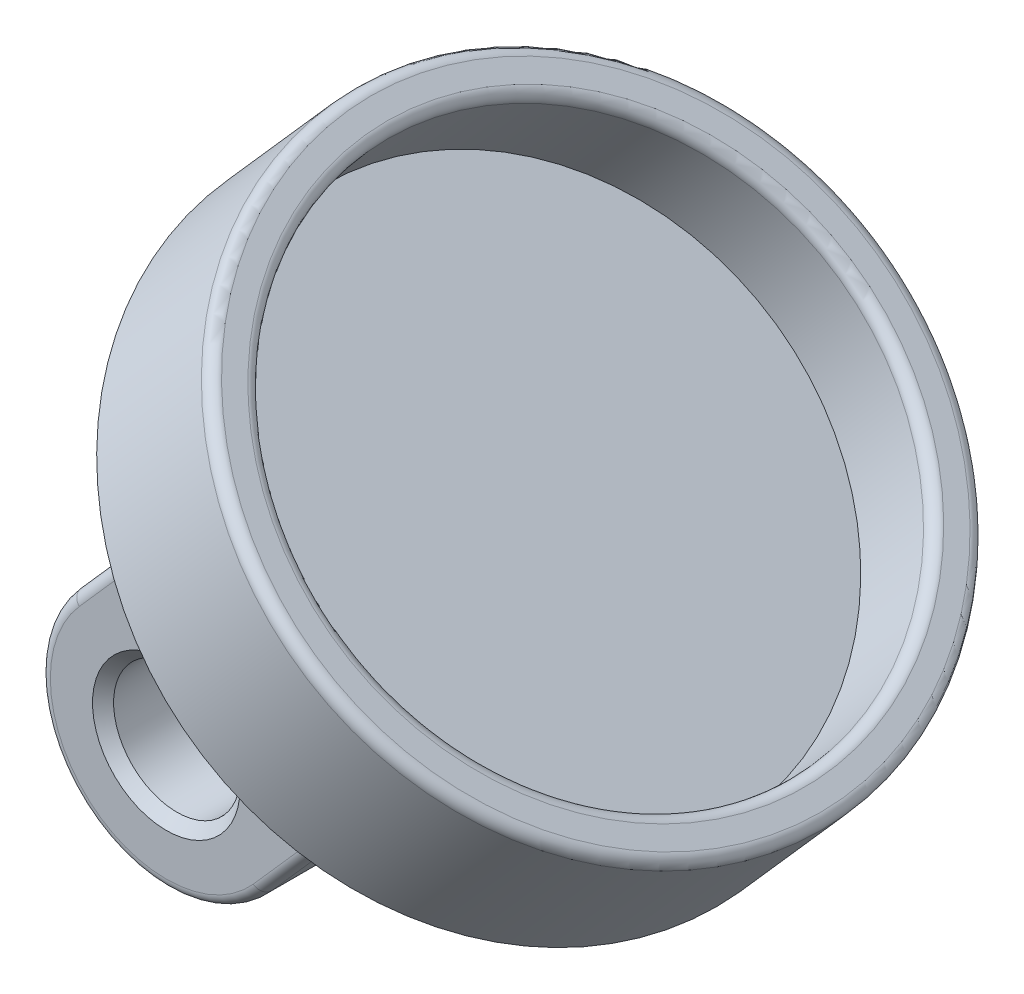
ISO-10303-21;
HEADER;
FILE_DESCRIPTION(('STEP AP214'),'2;1');
FILE_NAME('part.step','',(''),(''),'','','');
FILE_SCHEMA(('AUTOMOTIVE_DESIGN { 1 0 10303 214 1 1 1 1 }'));
ENDSEC;
DATA;
#1=APPLICATION_CONTEXT('core data for automotive mechanical design processes');
#2=APPLICATION_PROTOCOL_DEFINITION('international standard','automotive_design',2000,#1);
#3=PRODUCT_CONTEXT('',#1,'mechanical');
#4=PRODUCT('Part','Part','',(#3));
#5=PRODUCT_RELATED_PRODUCT_CATEGORY('part','',(#4));
#6=PRODUCT_DEFINITION_FORMATION('','',#4);
#7=PRODUCT_DEFINITION_CONTEXT('part definition',#1,'design');
#8=PRODUCT_DEFINITION('design','',#6,#7);
#9=PRODUCT_DEFINITION_SHAPE('','',#8);
#10=(LENGTH_UNIT() NAMED_UNIT(*) SI_UNIT(.MILLI.,.METRE.));
#11=(NAMED_UNIT(*) PLANE_ANGLE_UNIT() SI_UNIT($,.RADIAN.));
#12=(NAMED_UNIT(*) SI_UNIT($,.STERADIAN.) SOLID_ANGLE_UNIT());
#13=UNCERTAINTY_MEASURE_WITH_UNIT(LENGTH_MEASURE(1.E-05),#10,'distance_accuracy_value','');
#14=(GEOMETRIC_REPRESENTATION_CONTEXT(3) GLOBAL_UNCERTAINTY_ASSIGNED_CONTEXT((#13)) GLOBAL_UNIT_ASSIGNED_CONTEXT((#10,
#11,#12)) REPRESENTATION_CONTEXT('',''));
#15=CARTESIAN_POINT('',(0.,0.,0.));
#16=DIRECTION('',(0.,0.,1.));
#17=DIRECTION('',(1.,0.,0.));
#18=AXIS2_PLACEMENT_3D('',#15,#16,#17);
#19=CARTESIAN_POINT('',(24.6905324374804,73.3675287149736,0.));
#20=DIRECTION('',(0.66175059074416,0.749724053002006,0.));
#21=DIRECTION('',(-0.749724053002006,0.66175059074416,0.));
#22=AXIS2_PLACEMENT_3D('',#19,#20,#21);
#23=PLANE('',#22);
#24=DIRECTION('',(0.,0.,1.));
#25=VECTOR('',#24,1.);
#26=CARTESIAN_POINT('',(19.4424640664664,77.9997828501827,0.));
#27=LINE('',#26,#25);
#28=CARTESIAN_POINT('',(19.4424640664664,77.9997828501827,-6.5));
#29=VERTEX_POINT('',#28);
#30=CARTESIAN_POINT('',(19.4424640664664,77.9997828501827,6.5));
#31=VERTEX_POINT('',#30);
#32=EDGE_CURVE('E234',#29,#31,#27,.T.);
#33=ORIENTED_EDGE('',*,*,#32,.T.);
#34=CARTESIAN_POINT('',(20.5670501459694,77.0071569640665,6.5));
#35=DIRECTION('',(0.66175059074416,0.749724053002006,0.));
#36=DIRECTION('',(-0.749724053002006,0.66175059074416,0.));
#37=AXIS2_PLACEMENT_3D('',#34,#35,#36);
#38=CIRCLE('',#37,1.49999999999999);
#39=CARTESIAN_POINT('',(20.5670501459694,77.0071569640665,7.99999999999999));
#40=VERTEX_POINT('',#39);
#41=EDGE_CURVE('E236',#31,#40,#38,.T.);
#42=ORIENTED_EDGE('',*,*,#41,.T.);
#43=DIRECTION('',(0.749724053002006,-0.66175059074416,0.));
#44=VECTOR('',#43,1.);
#45=CARTESIAN_POINT('',(24.6905324374804,73.3675287149736,7.99999999999999));
#46=LINE('',#45,#44);
#47=CARTESIAN_POINT('',(28.8140147289915,69.7279004658807,7.99999999999999));
#48=VERTEX_POINT('',#47);
#49=EDGE_CURVE('E222',#40,#48,#46,.T.);
#50=ORIENTED_EDGE('',*,*,#49,.T.);
#51=CARTESIAN_POINT('',(28.8140147289915,69.7279004658807,6.5));
#52=DIRECTION('',(0.66175059074416,0.749724053002006,0.));
#53=DIRECTION('',(-0.749724053002006,0.66175059074416,0.));
#54=AXIS2_PLACEMENT_3D('',#51,#52,#53);
#55=CIRCLE('',#54,1.49999999999999);
#56=CARTESIAN_POINT('',(29.9386008084945,68.7352745797645,6.5));
#57=VERTEX_POINT('',#56);
#58=EDGE_CURVE('E224',#48,#57,#55,.T.);
#59=ORIENTED_EDGE('',*,*,#58,.T.);
#60=DIRECTION('',(0.,0.,-1.));
#61=VECTOR('',#60,1.);
#62=CARTESIAN_POINT('',(29.9386008084945,68.7352745797645,-6.5));
#63=LINE('',#62,#61);
#64=CARTESIAN_POINT('',(29.9386008084945,68.7352745797645,-6.5));
#65=VERTEX_POINT('',#64);
#66=EDGE_CURVE('E226',#57,#65,#63,.T.);
#67=ORIENTED_EDGE('',*,*,#66,.T.);
#68=CARTESIAN_POINT('',(28.8140147289915,69.7279004658807,-6.5));
#69=DIRECTION('',(0.66175059074416,0.749724053002006,0.));
#70=DIRECTION('',(-0.749724053002006,0.66175059074416,0.));
#71=AXIS2_PLACEMENT_3D('',#68,#69,#70);
#72=CIRCLE('',#71,1.49999999999999);
#73=CARTESIAN_POINT('',(28.8140147289915,69.7279004658807,-7.99999999999999));
#74=VERTEX_POINT('',#73);
#75=EDGE_CURVE('E228',#65,#74,#72,.T.);
#76=ORIENTED_EDGE('',*,*,#75,.T.);
#77=DIRECTION('',(-0.749724053002006,0.66175059074416,0.));
#78=VECTOR('',#77,1.);
#79=CARTESIAN_POINT('',(20.5670501459694,77.0071569640665,-7.99999999999999));
#80=LINE('',#79,#78);
#81=CARTESIAN_POINT('',(20.5670501459694,77.0071569640665,-7.99999999999999));
#82=VERTEX_POINT('',#81);
#83=EDGE_CURVE('E230',#74,#82,#80,.T.);
#84=ORIENTED_EDGE('',*,*,#83,.T.);
#85=CARTESIAN_POINT('',(20.5670501459694,77.0071569640665,-6.5));
#86=DIRECTION('',(0.66175059074416,0.749724053002006,0.));
#87=DIRECTION('',(-0.749724053002006,0.66175059074416,0.));
#88=AXIS2_PLACEMENT_3D('',#85,#86,#87);
#89=CIRCLE('',#88,1.49999999999999);
#90=EDGE_CURVE('E232',#82,#29,#89,.T.);
#91=ORIENTED_EDGE('',*,*,#90,.T.);
#92=EDGE_LOOP('',(#33,#42,#50,#59,#67,#76,#84,#91));
#93=FACE_BOUND('',#92,.T.);
#94=CARTESIAN_POINT('',(24.6905324374804,73.3675287149736,0.));
#95=DIRECTION('',(0.66175059074416,0.749724053002006,0.));
#96=DIRECTION('',(-0.749724053002006,0.66175059074416,0.));
#97=AXIS2_PLACEMENT_3D('',#94,#95,#96);
#98=CIRCLE('',#97,13.7);
#99=CARTESIAN_POINT('',(14.4193129113529,82.4335118081686,0.));
#100=VERTEX_POINT('',#99);
#101=EDGE_CURVE('E219',#100,#100,#98,.F.);
#102=ORIENTED_EDGE('',*,*,#101,.T.);
#103=EDGE_LOOP('',(#102));
#104=FACE_BOUND('',#103,.T.);
#105=ADVANCED_FACE('F74',(#93,#104),#23,.F.);
#106=CARTESIAN_POINT('',(24.6905324374804,73.3675287149736,0.));
#107=DIRECTION('',(0.66175059074416,0.749724053002006,0.));
#108=DIRECTION('',(-0.749724053002006,0.66175059074416,0.));
#109=AXIS2_PLACEMENT_3D('',#106,#107,#108);
#110=CYLINDRICAL_SURFACE('',#109,14.7);
#111=CARTESIAN_POINT('',(25.3522830282246,74.1172527679756,0.));
#112=DIRECTION('',(0.661750590744159,0.749724053002007,0.));
#113=DIRECTION('',(-0.749724053002007,0.66175059074416,0.));
#114=AXIS2_PLACEMENT_3D('',#111,#112,#113);
#115=CIRCLE('',#114,14.7);
#116=CARTESIAN_POINT('',(14.3313394490951,83.8449864519147,0.));
#117=VERTEX_POINT('',#116);
#118=EDGE_CURVE('E14',#117,#117,#115,.T.);
#119=ORIENTED_EDGE('',*,*,#118,.T.);
#120=EDGE_LOOP('',(#119));
#121=FACE_BOUND('',#120,.T.);
#122=CARTESIAN_POINT('',(30.3154124588058,79.7401831654906,0.));
#123=DIRECTION('',(0.66175059074416,0.749724053002006,0.));
#124=DIRECTION('',(-0.749724053002006,0.66175059074416,0.));
#125=AXIS2_PLACEMENT_3D('',#122,#123,#124);
#126=CIRCLE('',#125,14.7);
#127=CARTESIAN_POINT('',(19.2944688796763,89.4679168494298,0.));
#128=VERTEX_POINT('',#127);
#129=EDGE_CURVE('E187',#128,#128,#126,.F.);
#130=ORIENTED_EDGE('',*,*,#129,.T.);
#131=EDGE_LOOP('',(#130));
#132=FACE_BOUND('',#131,.T.);
#133=ADVANCED_FACE('F358',(#121,#132),#110,.T.);
#134=CARTESIAN_POINT('',(30.5123779369808,70.8964732765126,-7.));
#135=DIRECTION('',(-0.749724053002007,0.66175059074416,0.));
#136=DIRECTION('',(-0.66175059074416,-0.749724053002007,0.));
#137=AXIS2_PLACEMENT_3D('',#134,#135,#136);
#138=PLANE('',#137);
#139=DIRECTION('',(-0.66175059074416,-0.749724053002007,0.));
#140=VECTOR('',#139,1.);
#141=CARTESIAN_POINT('',(30.5123779369808,70.8964732765126,-6.5));
#142=LINE('',#141,#140);
#143=CARTESIAN_POINT('',(21.7818789238278,61.0053372557492,-6.5));
#144=VERTEX_POINT('',#143);
#145=CARTESIAN_POINT('',(28.5271261647483,68.6473011175066,-6.5));
#146=VERTEX_POINT('',#145);
#147=EDGE_CURVE('E285',#144,#146,#142,.F.);
#148=ORIENTED_EDGE('',*,*,#147,.T.);
#149=DIRECTION('',(0.,0.,1.));
#150=VECTOR('',#149,1.);
#151=CARTESIAN_POINT('',(28.5271261647483,68.6473011175066,6.5));
#152=LINE('',#151,#150);
#153=CARTESIAN_POINT('',(28.5271261647483,68.6473011175066,6.5));
#154=VERTEX_POINT('',#153);
#155=EDGE_CURVE('E99',#146,#154,#152,.T.);
#156=ORIENTED_EDGE('',*,*,#155,.T.);
#157=DIRECTION('',(-0.66175059074416,-0.749724053002007,0.));
#158=VECTOR('',#157,1.);
#159=CARTESIAN_POINT('',(21.7818789238278,61.0053372557492,6.5));
#160=LINE('',#159,#158);
#161=CARTESIAN_POINT('',(21.7818789238278,61.0053372557492,6.5));
#162=VERTEX_POINT('',#161);
#163=EDGE_CURVE('E290',#154,#162,#160,.T.);
#164=ORIENTED_EDGE('',*,*,#163,.T.);
#165=DIRECTION('',(0.,0.,1.));
#166=VECTOR('',#165,1.);
#167=CARTESIAN_POINT('',(21.7818789238278,61.0053372557492,-7.));
#168=LINE('',#167,#166);
#169=EDGE_CURVE('E195',#144,#162,#168,.T.);
#170=ORIENTED_EDGE('',*,*,#169,.F.);
#171=EDGE_LOOP('',(#148,#156,#164,#170));
#172=FACE_BOUND('',#171,.T.);
#173=ADVANCED_FACE('F287',(#172),#138,.F.);
#174=CARTESIAN_POINT('',(21.5156893009567,78.8374803654426,-7.));
#175=DIRECTION('',(-0.749724053002006,0.661750590744161,0.));
#176=DIRECTION('',(-0.661750590744161,-0.749724053002006,0.));
#177=AXIS2_PLACEMENT_3D('',#174,#175,#176);
#178=PLANE('',#177);
#179=DIRECTION('',(-0.661750590744161,-0.749724053002006,0.));
#180=VECTOR('',#179,1.);
#181=CARTESIAN_POINT('',(21.5156893009567,78.8374803654426,6.5));
#182=LINE('',#181,#180);
#183=CARTESIAN_POINT('',(12.7851902878038,68.9463443446791,6.5));
#184=VERTEX_POINT('',#183);
#185=CARTESIAN_POINT('',(19.5304375287242,76.5883082064365,6.5));
#186=VERTEX_POINT('',#185);
#187=EDGE_CURVE('E297',#184,#186,#182,.F.);
#188=ORIENTED_EDGE('',*,*,#187,.T.);
#189=DIRECTION('',(0.,0.,-1.));
#190=VECTOR('',#189,1.);
#191=CARTESIAN_POINT('',(19.5304375287242,76.5883082064365,-7.));
#192=LINE('',#191,#190);
#193=CARTESIAN_POINT('',(19.5304375287242,76.5883082064365,-6.5));
#194=VERTEX_POINT('',#193);
#195=EDGE_CURVE('E242',#186,#194,#192,.T.);
#196=ORIENTED_EDGE('',*,*,#195,.T.);
#197=DIRECTION('',(-0.661750590744161,-0.749724053002006,0.));
#198=VECTOR('',#197,1.);
#199=CARTESIAN_POINT('',(12.7851902878038,68.9463443446791,-6.5));
#200=LINE('',#199,#198);
#201=CARTESIAN_POINT('',(12.7851902878038,68.9463443446791,-6.5));
#202=VERTEX_POINT('',#201);
#203=EDGE_CURVE('E300',#194,#202,#200,.T.);
#204=ORIENTED_EDGE('',*,*,#203,.T.);
#205=DIRECTION('',(0.,0.,1.));
#206=VECTOR('',#205,1.);
#207=CARTESIAN_POINT('',(12.7851902878038,68.9463443446791,-7.));
#208=LINE('',#207,#206);
#209=EDGE_CURVE('E191',#202,#184,#208,.T.);
#210=ORIENTED_EDGE('',*,*,#209,.T.);
#211=EDGE_LOOP('',(#188,#196,#204,#210));
#212=FACE_BOUND('',#211,.T.);
#213=ADVANCED_FACE('F330',(#212),#178,.T.);
#214=CARTESIAN_POINT('',(17.2835346058158,64.9758408002142,-7.));
#215=DIRECTION('',(0.,0.,1.));
#216=DIRECTION('',(1.,0.,0.));
#217=AXIS2_PLACEMENT_3D('',#214,#215,#216);
#218=PLANE('',#217);
#219=CARTESIAN_POINT('',(17.2835346058158,64.9758408002142,-7.));
#220=DIRECTION('',(0.,0.,1.));
#221=DIRECTION('',(1.,0.,0.));
#222=AXIS2_PLACEMENT_3D('',#219,#220,#221);
#223=CIRCLE('',#222,3.5);
#224=CARTESIAN_POINT('',(20.7835346058158,64.9758408002142,-7.));
#225=VERTEX_POINT('',#224);
#226=EDGE_CURVE('E216',#225,#225,#223,.T.);
#227=ORIENTED_EDGE('',*,*,#226,.T.);
#228=EDGE_LOOP('',(#227));
#229=FACE_BOUND('',#228,.T.);
#230=DIRECTION('',(-0.661750590744161,-0.749724053002006,0.));
#231=VECTOR('',#230,1.);
#232=CARTESIAN_POINT('',(20.5670501459694,77.0071569640665,-7.));
#233=LINE('',#232,#231);
#234=CARTESIAN_POINT('',(13.1600523143048,68.6154690493071,-7.));
#235=VERTEX_POINT('',#234);
#236=CARTESIAN_POINT('',(19.9052995552252,76.2574329110645,-7.));
#237=VERTEX_POINT('',#236);
#238=EDGE_CURVE('E170',#235,#237,#233,.F.);
#239=ORIENTED_EDGE('',*,*,#238,.T.);
#240=DIRECTION('',(0.749724053002006,-0.66175059074416,0.));
#241=VECTOR('',#240,1.);
#242=CARTESIAN_POINT('',(28.1522641382473,68.9781764128787,-7.));
#243=LINE('',#242,#241);
#244=CARTESIAN_POINT('',(28.1522641382473,68.9781764128787,-7.));
#245=VERTEX_POINT('',#244);
#246=EDGE_CURVE('E245',#237,#245,#243,.T.);
#247=ORIENTED_EDGE('',*,*,#246,.T.);
#248=DIRECTION('',(-0.66175059074416,-0.749724053002007,0.));
#249=VECTOR('',#248,1.);
#250=CARTESIAN_POINT('',(21.4070168973268,61.3362125511213,-7.));
#251=LINE('',#250,#249);
#252=CARTESIAN_POINT('',(21.4070168973268,61.3362125511213,-7.));
#253=VERTEX_POINT('',#252);
#254=EDGE_CURVE('E173',#245,#253,#251,.T.);
#255=ORIENTED_EDGE('',*,*,#254,.T.);
#256=CARTESIAN_POINT('',(17.2835346058158,64.9758408002142,-7.));
#257=DIRECTION('',(0.,0.,1.));
#258=DIRECTION('',(1.,0.,0.));
#259=AXIS2_PLACEMENT_3D('',#256,#257,#258);
#260=CIRCLE('',#259,5.50000000000001);
#261=EDGE_CURVE('E167',#253,#235,#260,.F.);
#262=ORIENTED_EDGE('',*,*,#261,.T.);
#263=EDGE_LOOP('',(#239,#247,#255,#262));
#264=FACE_BOUND('',#263,.T.);
#265=ADVANCED_FACE('F169',(#229,#264),#218,.F.);
#266=CARTESIAN_POINT('',(17.2835346058158,64.9758408002142,7.));
#267=DIRECTION('',(0.,0.,1.));
#268=DIRECTION('',(1.,0.,0.));
#269=AXIS2_PLACEMENT_3D('',#266,#267,#268);
#270=PLANE('',#269);
#271=CARTESIAN_POINT('',(17.2835346058158,64.9758408002142,7.));
#272=DIRECTION('',(0.,0.,1.));
#273=DIRECTION('',(1.,0.,0.));
#274=AXIS2_PLACEMENT_3D('',#271,#272,#273);
#275=CIRCLE('',#274,3.50000000000002);
#276=CARTESIAN_POINT('',(20.7835346058158,64.9758408002142,7.));
#277=VERTEX_POINT('',#276);
#278=EDGE_CURVE('E213',#277,#277,#275,.F.);
#279=ORIENTED_EDGE('',*,*,#278,.T.);
#280=EDGE_LOOP('',(#279));
#281=FACE_BOUND('',#280,.T.);
#282=DIRECTION('',(-0.66175059074416,-0.749724053002007,0.));
#283=VECTOR('',#282,1.);
#284=CARTESIAN_POINT('',(28.8140147289915,69.7279004658807,7.));
#285=LINE('',#284,#283);
#286=CARTESIAN_POINT('',(21.4070168973268,61.3362125511213,7.));
#287=VERTEX_POINT('',#286);
#288=CARTESIAN_POINT('',(28.1522641382473,68.9781764128787,7.));
#289=VERTEX_POINT('',#288);
#290=EDGE_CURVE('E210',#287,#289,#285,.F.);
#291=ORIENTED_EDGE('',*,*,#290,.T.);
#292=DIRECTION('',(-0.749724053002006,0.66175059074416,0.));
#293=VECTOR('',#292,1.);
#294=CARTESIAN_POINT('',(24.0287818467363,72.6178046619716,7.));
#295=LINE('',#294,#293);
#296=CARTESIAN_POINT('',(19.9052995552252,76.2574329110645,7.));
#297=VERTEX_POINT('',#296);
#298=EDGE_CURVE('E83',#289,#297,#295,.T.);
#299=ORIENTED_EDGE('',*,*,#298,.T.);
#300=DIRECTION('',(-0.661750590744161,-0.749724053002006,0.));
#301=VECTOR('',#300,1.);
#302=CARTESIAN_POINT('',(13.1600523143048,68.6154690493071,7.));
#303=LINE('',#302,#301);
#304=CARTESIAN_POINT('',(13.1600523143048,68.6154690493071,7.));
#305=VERTEX_POINT('',#304);
#306=EDGE_CURVE('E302',#297,#305,#303,.T.);
#307=ORIENTED_EDGE('',*,*,#306,.T.);
#308=CARTESIAN_POINT('',(17.2835346058158,64.9758408002142,7.));
#309=DIRECTION('',(0.,0.,1.));
#310=DIRECTION('',(1.,0.,0.));
#311=AXIS2_PLACEMENT_3D('',#308,#309,#310);
#312=CIRCLE('',#311,5.50000000000001);
#313=EDGE_CURVE('E304',#305,#287,#312,.T.);
#314=ORIENTED_EDGE('',*,*,#313,.T.);
#315=EDGE_LOOP('',(#291,#299,#307,#314));
#316=FACE_BOUND('',#315,.T.);
#317=ADVANCED_FACE('F307',(#281,#316),#270,.T.);
#318=CARTESIAN_POINT('',(17.2835346058158,64.9758408002142,-7.));
#319=DIRECTION('',(0.,0.,1.));
#320=DIRECTION('',(1.,0.,0.));
#321=AXIS2_PLACEMENT_3D('',#318,#319,#320);
#322=CYLINDRICAL_SURFACE('',#321,6.00000000000001);
#323=ORIENTED_EDGE('',*,*,#209,.F.);
#324=CARTESIAN_POINT('',(17.2835346058158,64.9758408002142,-6.5));
#325=DIRECTION('',(0.,0.,1.));
#326=DIRECTION('',(1.,0.,0.));
#327=AXIS2_PLACEMENT_3D('',#324,#325,#326);
#328=CIRCLE('',#327,6.00000000000001);
#329=EDGE_CURVE('E190',#202,#144,#328,.T.);
#330=ORIENTED_EDGE('',*,*,#329,.T.);
#331=ORIENTED_EDGE('',*,*,#169,.T.);
#332=CARTESIAN_POINT('',(17.2835346058158,64.9758408002142,6.5));
#333=DIRECTION('',(0.,0.,1.));
#334=DIRECTION('',(1.,0.,0.));
#335=AXIS2_PLACEMENT_3D('',#332,#333,#334);
#336=CIRCLE('',#335,6.00000000000001);
#337=EDGE_CURVE('E289',#162,#184,#336,.F.);
#338=ORIENTED_EDGE('',*,*,#337,.T.);
#339=EDGE_LOOP('',(#323,#330,#331,#338));
#340=FACE_BOUND('',#339,.T.);
#341=ADVANCED_FACE('F333',(#340),#322,.T.);
#342=CARTESIAN_POINT('',(17.2835346058158,64.9758408002142,-7.));
#343=DIRECTION('',(0.,0.,1.));
#344=DIRECTION('',(1.,0.,0.));
#345=AXIS2_PLACEMENT_3D('',#342,#343,#344);
#346=CYLINDRICAL_SURFACE('',#345,3.);
#347=CARTESIAN_POINT('',(17.2835346058158,64.9758408002142,6.49999999999999));
#348=DIRECTION('',(0.,0.,1.));
#349=DIRECTION('',(1.,0.,0.));
#350=AXIS2_PLACEMENT_3D('',#347,#348,#349);
#351=CIRCLE('',#350,3.);
#352=CARTESIAN_POINT('',(20.2835346058158,64.9758408002142,6.49999999999999));
#353=VERTEX_POINT('',#352);
#354=EDGE_CURVE('E209',#353,#353,#351,.T.);
#355=ORIENTED_EDGE('',*,*,#354,.T.);
#356=EDGE_LOOP('',(#355));
#357=FACE_BOUND('',#356,.T.);
#358=CARTESIAN_POINT('',(17.2835346058158,64.9758408002142,-6.5));
#359=DIRECTION('',(0.,0.,1.));
#360=DIRECTION('',(1.,0.,0.));
#361=AXIS2_PLACEMENT_3D('',#358,#359,#360);
#362=CIRCLE('',#361,3.);
#363=CARTESIAN_POINT('',(20.2835346058158,64.9758408002142,-6.5));
#364=VERTEX_POINT('',#363);
#365=EDGE_CURVE('E206',#364,#364,#362,.F.);
#366=ORIENTED_EDGE('',*,*,#365,.T.);
#367=EDGE_LOOP('',(#366));
#368=FACE_BOUND('',#367,.T.);
#369=ADVANCED_FACE('F372',(#357,#368),#346,.F.);
#370=CARTESIAN_POINT('',(30.6462877541779,80.1150451919916,0.));
#371=DIRECTION('',(0.66175059074416,0.749724053002006,0.));
#372=DIRECTION('',(-0.749724053002006,0.66175059074416,0.));
#373=AXIS2_PLACEMENT_3D('',#370,#371,#372);
#374=PLANE('',#373);
#375=CARTESIAN_POINT('',(30.6462877541779,80.1150451919916,0.));
#376=DIRECTION('',(0.66175059074416,0.749724053002006,0.));
#377=DIRECTION('',(-0.749724053002006,0.66175059074416,0.));
#378=AXIS2_PLACEMENT_3D('',#375,#376,#377);
#379=CIRCLE('',#378,13.2);
#380=CARTESIAN_POINT('',(20.7499302545514,88.8501529898145,0.));
#381=VERTEX_POINT('',#380);
#382=EDGE_CURVE('E624',#381,#381,#379,.F.);
#383=ORIENTED_EDGE('',*,*,#382,.T.);
#384=EDGE_LOOP('',(#383));
#385=FACE_BOUND('',#384,.T.);
#386=CARTESIAN_POINT('',(30.6462877541779,80.1150451919916,0.));
#387=DIRECTION('',(0.66175059074416,0.749724053002006,0.));
#388=DIRECTION('',(-0.749724053002006,0.66175059074416,0.));
#389=AXIS2_PLACEMENT_3D('',#386,#387,#388);
#390=CIRCLE('',#389,14.2);
#391=CARTESIAN_POINT('',(20.0002062015494,89.5119035805587,0.));
#392=VERTEX_POINT('',#391);
#393=EDGE_CURVE('E618',#392,#392,#390,.T.);
#394=ORIENTED_EDGE('',*,*,#393,.T.);
#395=EDGE_LOOP('',(#394));
#396=FACE_BOUND('',#395,.T.);
#397=ADVANCED_FACE('F375',(#385,#396),#374,.T.);
#398=CARTESIAN_POINT('',(30.6462877541779,80.1150451919916,0.));
#399=DIRECTION('',(-0.66175059074416,-0.749724053002006,0.));
#400=DIRECTION('',(0.749724053002006,-0.66175059074416,0.));
#401=AXIS2_PLACEMENT_3D('',#398,#399,#400);
#402=CYLINDRICAL_SURFACE('',#401,12.7);
#403=CARTESIAN_POINT('',(30.3154124588058,79.7401831654906,0.));
#404=DIRECTION('',(0.66175059074416,0.749724053002006,0.));
#405=DIRECTION('',(-0.749724053002006,0.66175059074416,0.));
#406=AXIS2_PLACEMENT_3D('',#403,#404,#405);
#407=CIRCLE('',#406,12.7);
#408=CARTESIAN_POINT('',(20.7939169856803,88.1444156679415,0.));
#409=VERTEX_POINT('',#408);
#410=EDGE_CURVE('E615',#409,#409,#407,.T.);
#411=ORIENTED_EDGE('',*,*,#410,.T.);
#412=EDGE_LOOP('',(#411));
#413=FACE_BOUND('',#412,.T.);
#414=CARTESIAN_POINT('',(27.3375348004571,76.3664249269816,0.));
#415=DIRECTION('',(0.66175059074416,0.749724053002006,0.));
#416=DIRECTION('',(-0.749724053002006,0.66175059074416,0.));
#417=AXIS2_PLACEMENT_3D('',#414,#415,#416);
#418=CIRCLE('',#417,12.7);
#419=CARTESIAN_POINT('',(17.8160393273316,84.7706574294324,0.));
#420=VERTEX_POINT('',#419);
#421=EDGE_CURVE('E613',#420,#420,#418,.F.);
#422=ORIENTED_EDGE('',*,*,#421,.T.);
#423=EDGE_LOOP('',(#422));
#424=FACE_BOUND('',#423,.T.);
#425=ADVANCED_FACE('F528',(#413,#424),#402,.F.);
#426=CARTESIAN_POINT('',(27.3375348004571,76.3664249269816,0.));
#427=DIRECTION('',(0.66175059074416,0.749724053002006,0.));
#428=DIRECTION('',(-0.749724053002006,0.66175059074416,0.));
#429=AXIS2_PLACEMENT_3D('',#426,#427,#428);
#430=PLANE('',#429);
#431=ORIENTED_EDGE('',*,*,#421,.F.);
#432=EDGE_LOOP('',(#431));
#433=FACE_BOUND('',#432,.T.);
#434=ADVANCED_FACE('F366',(#433),#430,.T.);
#435=CARTESIAN_POINT('',(30.3154124588058,79.7401831654906,0.));
#436=DIRECTION('',(0.66175059074416,0.749724053002006,0.));
#437=DIRECTION('',(-0.749724053002006,0.66175059074416,0.));
#438=AXIS2_PLACEMENT_3D('',#435,#436,#437);
#439=TOROIDAL_SURFACE('',#438,13.2,0.5);
#440=ORIENTED_EDGE('',*,*,#382,.F.);
#441=EDGE_LOOP('',(#440));
#442=FACE_BOUND('',#441,.T.);
#443=ORIENTED_EDGE('',*,*,#410,.F.);
#444=EDGE_LOOP('',(#443));
#445=FACE_BOUND('',#444,.T.);
#446=ADVANCED_FACE('F386',(#442,#445),#439,.T.);
#447=CARTESIAN_POINT('',(30.3154124588058,79.7401831654906,0.));
#448=DIRECTION('',(0.66175059074416,0.749724053002006,0.));
#449=DIRECTION('',(-0.749724053002006,0.66175059074416,0.));
#450=AXIS2_PLACEMENT_3D('',#447,#448,#449);
#451=TOROIDAL_SURFACE('',#450,14.2,0.5);
#452=ORIENTED_EDGE('',*,*,#129,.F.);
#453=EDGE_LOOP('',(#452));
#454=FACE_BOUND('',#453,.T.);
#455=ORIENTED_EDGE('',*,*,#393,.F.);
#456=EDGE_LOOP('',(#455));
#457=FACE_BOUND('',#456,.T.);
#458=ADVANCED_FACE('F389',(#454,#457),#451,.T.);
#459=CARTESIAN_POINT('',(21.8905513274577,78.5066050700705,-6.5));
#460=DIRECTION('',(0.661750590744161,0.749724053002006,0.));
#461=DIRECTION('',(-0.749724053002006,0.661750590744161,0.));
#462=AXIS2_PLACEMENT_3D('',#459,#460,#461);
#463=CYLINDRICAL_SURFACE('',#462,0.5);
#464=ORIENTED_EDGE('',*,*,#203,.F.);
#465=CARTESIAN_POINT('',(19.9052995552252,76.2574329110645,-6.5));
#466=DIRECTION('',(0.661750590744162,0.749724053002004,0.));
#467=DIRECTION('',(-0.749724053002004,0.661750590744162,0.));
#468=AXIS2_PLACEMENT_3D('',#465,#466,#467);
#469=CIRCLE('',#468,0.5);
#470=EDGE_CURVE('E186',#194,#237,#469,.F.);
#471=ORIENTED_EDGE('',*,*,#470,.T.);
#472=ORIENTED_EDGE('',*,*,#238,.F.);
#473=CARTESIAN_POINT('',(13.1600523143048,68.6154690493071,-6.5));
#474=DIRECTION('',(-0.661750590744163,-0.749724053002004,0.));
#475=DIRECTION('',(0.749724053002004,-0.661750590744163,0.));
#476=AXIS2_PLACEMENT_3D('',#473,#474,#475);
#477=CIRCLE('',#476,0.5);
#478=EDGE_CURVE('E183',#202,#235,#477,.T.);
#479=ORIENTED_EDGE('',*,*,#478,.F.);
#480=EDGE_LOOP('',(#464,#471,#472,#479));
#481=FACE_BOUND('',#480,.T.);
#482=ADVANCED_FACE('F182',(#481),#463,.T.);
#483=CARTESIAN_POINT('',(17.2835346058158,64.9758408002142,-6.5));
#484=DIRECTION('',(0.,0.,1.));
#485=DIRECTION('',(1.,0.,0.));
#486=AXIS2_PLACEMENT_3D('',#483,#484,#485);
#487=TOROIDAL_SURFACE('',#486,5.50000000000001,0.5);
#488=ORIENTED_EDGE('',*,*,#478,.T.);
#489=ORIENTED_EDGE('',*,*,#261,.F.);
#490=CARTESIAN_POINT('',(21.4070168973268,61.3362125511213,-6.5));
#491=DIRECTION('',(0.661750590744163,0.749724053002004,0.));
#492=DIRECTION('',(-0.749724053002004,0.661750590744163,0.));
#493=AXIS2_PLACEMENT_3D('',#490,#491,#492);
#494=CIRCLE('',#493,0.5);
#495=EDGE_CURVE('E192',#144,#253,#494,.T.);
#496=ORIENTED_EDGE('',*,*,#495,.F.);
#497=ORIENTED_EDGE('',*,*,#329,.F.);
#498=EDGE_LOOP('',(#488,#489,#496,#497));
#499=FACE_BOUND('',#498,.T.);
#500=ADVANCED_FACE('F189',(#499),#487,.T.);
#501=CARTESIAN_POINT('',(21.4070168973268,61.3362125511213,-6.5));
#502=DIRECTION('',(-0.66175059074416,-0.749724053002007,0.));
#503=DIRECTION('',(0.749724053002007,-0.66175059074416,0.));
#504=AXIS2_PLACEMENT_3D('',#501,#502,#503);
#505=CYLINDRICAL_SURFACE('',#504,0.5);
#506=ORIENTED_EDGE('',*,*,#254,.F.);
#507=CARTESIAN_POINT('',(28.1522641382473,68.9781764128787,-6.5));
#508=DIRECTION('',(0.661750590744154,0.749724053002012,0.));
#509=DIRECTION('',(-0.749724053002012,0.661750590744154,0.));
#510=AXIS2_PLACEMENT_3D('',#507,#508,#509);
#511=CIRCLE('',#510,0.5);
#512=EDGE_CURVE('E247',#245,#146,#511,.F.);
#513=ORIENTED_EDGE('',*,*,#512,.T.);
#514=ORIENTED_EDGE('',*,*,#147,.F.);
#515=ORIENTED_EDGE('',*,*,#495,.T.);
#516=EDGE_LOOP('',(#506,#513,#514,#515));
#517=FACE_BOUND('',#516,.T.);
#518=ADVANCED_FACE('F284',(#517),#505,.T.);
#519=CARTESIAN_POINT('',(13.1600523143048,68.6154690493071,6.5));
#520=DIRECTION('',(-0.661750590744161,-0.749724053002006,0.));
#521=DIRECTION('',(0.749724053002006,-0.661750590744161,0.));
#522=AXIS2_PLACEMENT_3D('',#519,#520,#521);
#523=CYLINDRICAL_SURFACE('',#522,0.5);
#524=ORIENTED_EDGE('',*,*,#306,.F.);
#525=CARTESIAN_POINT('',(19.9052995552252,76.2574329110645,6.5));
#526=DIRECTION('',(0.661750590744158,0.749724053002008,0.));
#527=DIRECTION('',(-0.749724053002008,0.661750590744159,0.));
#528=AXIS2_PLACEMENT_3D('',#525,#526,#527);
#529=CIRCLE('',#528,0.5);
#530=EDGE_CURVE('E239',#297,#186,#529,.F.);
#531=ORIENTED_EDGE('',*,*,#530,.T.);
#532=ORIENTED_EDGE('',*,*,#187,.F.);
#533=CARTESIAN_POINT('',(13.1600523143048,68.6154690493071,6.5));
#534=DIRECTION('',(-0.661750590744161,-0.749724053002005,0.));
#535=DIRECTION('',(0.749724053002005,-0.661750590744161,0.));
#536=AXIS2_PLACEMENT_3D('',#533,#534,#535);
#537=CIRCLE('',#536,0.5);
#538=EDGE_CURVE('E197',#305,#184,#537,.T.);
#539=ORIENTED_EDGE('',*,*,#538,.F.);
#540=EDGE_LOOP('',(#524,#531,#532,#539));
#541=FACE_BOUND('',#540,.T.);
#542=ADVANCED_FACE('F327',(#541),#523,.T.);
#543=CARTESIAN_POINT('',(17.2835346058158,64.9758408002142,6.5));
#544=DIRECTION('',(0.,0.,1.));
#545=DIRECTION('',(1.,0.,0.));
#546=AXIS2_PLACEMENT_3D('',#543,#544,#545);
#547=TOROIDAL_SURFACE('',#546,5.50000000000001,0.5);
#548=ORIENTED_EDGE('',*,*,#538,.T.);
#549=ORIENTED_EDGE('',*,*,#337,.F.);
#550=CARTESIAN_POINT('',(21.4070168973268,61.3362125511213,6.5));
#551=DIRECTION('',(0.661750590744152,0.749724053002014,0.));
#552=DIRECTION('',(-0.749724053002014,0.661750590744152,0.));
#553=AXIS2_PLACEMENT_3D('',#550,#551,#552);
#554=CIRCLE('',#553,0.5);
#555=EDGE_CURVE('E201',#287,#162,#554,.T.);
#556=ORIENTED_EDGE('',*,*,#555,.F.);
#557=ORIENTED_EDGE('',*,*,#313,.F.);
#558=EDGE_LOOP('',(#548,#549,#556,#557));
#559=FACE_BOUND('',#558,.T.);
#560=ADVANCED_FACE('F336',(#559),#547,.T.);
#561=CARTESIAN_POINT('',(30.1375159104798,71.2273485718847,6.5));
#562=DIRECTION('',(0.66175059074416,0.749724053002007,0.));
#563=DIRECTION('',(-0.749724053002007,0.66175059074416,0.));
#564=AXIS2_PLACEMENT_3D('',#561,#562,#563);
#565=CYLINDRICAL_SURFACE('',#564,0.5);
#566=ORIENTED_EDGE('',*,*,#163,.F.);
#567=CARTESIAN_POINT('',(28.1522641382473,68.9781764128787,6.5));
#568=DIRECTION('',(0.66175059074416,0.749724053002006,0.));
#569=DIRECTION('',(-0.749724053002006,0.66175059074416,0.));
#570=AXIS2_PLACEMENT_3D('',#567,#568,#569);
#571=CIRCLE('',#570,0.5);
#572=EDGE_CURVE('E91',#154,#289,#571,.F.);
#573=ORIENTED_EDGE('',*,*,#572,.T.);
#574=ORIENTED_EDGE('',*,*,#290,.F.);
#575=ORIENTED_EDGE('',*,*,#555,.T.);
#576=EDGE_LOOP('',(#566,#573,#574,#575));
#577=FACE_BOUND('',#576,.T.);
#578=ADVANCED_FACE('F337',(#577),#565,.T.);
#579=CARTESIAN_POINT('',(17.2835346058158,64.9758408002142,6.49999999999999));
#580=DIRECTION('',(0.,0.,1.));
#581=DIRECTION('',(1.,0.,0.));
#582=AXIS2_PLACEMENT_3D('',#579,#580,#581);
#583=CONICAL_SURFACE('',#582,3.,0.785398163397451);
#584=ORIENTED_EDGE('',*,*,#278,.F.);
#585=EDGE_LOOP('',(#584));
#586=FACE_BOUND('',#585,.T.);
#587=ORIENTED_EDGE('',*,*,#354,.F.);
#588=EDGE_LOOP('',(#587));
#589=FACE_BOUND('',#588,.T.);
#590=ADVANCED_FACE('F402',(#586,#589),#583,.F.);
#591=CARTESIAN_POINT('',(17.2835346058158,64.9758408002142,-7.));
#592=DIRECTION('',(0.,0.,-1.));
#593=DIRECTION('',(-1.,0.,0.));
#594=AXIS2_PLACEMENT_3D('',#591,#592,#593);
#595=CONICAL_SURFACE('',#594,3.5,0.785398163397451);
#596=ORIENTED_EDGE('',*,*,#365,.F.);
#597=EDGE_LOOP('',(#596));
#598=FACE_BOUND('',#597,.T.);
#599=ORIENTED_EDGE('',*,*,#226,.F.);
#600=EDGE_LOOP('',(#599));
#601=FACE_BOUND('',#600,.T.);
#602=ADVANCED_FACE('F409',(#598,#601),#595,.F.);
#603=CARTESIAN_POINT('',(28.8140147289915,69.7279004658807,-6.5));
#604=DIRECTION('',(0.661750590744154,0.749724053002012,0.));
#605=DIRECTION('',(-0.749724053002012,0.661750590744154,0.));
#606=AXIS2_PLACEMENT_3D('',#603,#604,#605);
#607=CONICAL_SURFACE('',#606,1.5,0.785398163397448);
#608=DIRECTION('',(0.99806329206578,0.0622066317269933,0.));
#609=VECTOR('',#608,1.);
#610=CARTESIAN_POINT('',(28.5271261647483,68.6473011175066,-6.5));
#611=LINE('',#610,#609);
#612=EDGE_CURVE('E267',#146,#65,#611,.T.);
#613=ORIENTED_EDGE('',*,*,#612,.F.);
#614=ORIENTED_EDGE('',*,*,#512,.F.);
#615=DIRECTION('',(-0.467928330169402,-0.530134961896385,0.707106781186543));
#616=VECTOR('',#615,1.);
#617=CARTESIAN_POINT('',(28.8140147289915,69.7279004658807,-7.99999999999999));
#618=LINE('',#617,#616);
#619=EDGE_CURVE('E78',#74,#245,#618,.T.);
#620=ORIENTED_EDGE('',*,*,#619,.F.);
#621=ORIENTED_EDGE('',*,*,#75,.F.);
#622=EDGE_LOOP('',(#613,#614,#620,#621));
#623=FACE_BOUND('',#622,.T.);
#624=ADVANCED_FACE('F281',(#623),#607,.T.);
#625=CARTESIAN_POINT('',(24.6905324374804,73.3675287149736,-7.99999999999999));
#626=DIRECTION('',(-0.4679283301694,-0.530134961896383,-0.707106781186546));
#627=DIRECTION('',(0.749724053002006,-0.66175059074416,0.));
#628=AXIS2_PLACEMENT_3D('',#625,#626,#627);
#629=PLANE('',#628);
#630=ORIENTED_EDGE('',*,*,#619,.T.);
#631=ORIENTED_EDGE('',*,*,#246,.F.);
#632=DIRECTION('',(-0.467928330169391,-0.530134961896389,0.707106781186547));
#633=VECTOR('',#632,1.);
#634=CARTESIAN_POINT('',(20.5670501459694,77.0071569640665,-7.99999999999999));
#635=LINE('',#634,#633);
#636=EDGE_CURVE('E265',#82,#237,#635,.T.);
#637=ORIENTED_EDGE('',*,*,#636,.F.);
#638=ORIENTED_EDGE('',*,*,#83,.F.);
#639=EDGE_LOOP('',(#630,#631,#637,#638));
#640=FACE_BOUND('',#639,.T.);
#641=ADVANCED_FACE('F276',(#640),#629,.T.);
#642=CARTESIAN_POINT('',(29.9386008084945,68.7352745797645,0.));
#643=DIRECTION('',(0.0622066317269832,-0.99806329206578,0.));
#644=DIRECTION('',(0.,0.,1.));
#645=AXIS2_PLACEMENT_3D('',#642,#643,#644);
#646=PLANE('',#645);
#647=ORIENTED_EDGE('',*,*,#612,.T.);
#648=ORIENTED_EDGE('',*,*,#66,.F.);
#649=DIRECTION('',(0.99806329206578,0.0622066317269831,0.));
#650=VECTOR('',#649,1.);
#651=CARTESIAN_POINT('',(28.5271261647483,68.6473011175066,6.5));
#652=LINE('',#651,#650);
#653=EDGE_CURVE('E262',#154,#57,#652,.T.);
#654=ORIENTED_EDGE('',*,*,#653,.F.);
#655=ORIENTED_EDGE('',*,*,#155,.F.);
#656=EDGE_LOOP('',(#647,#648,#654,#655));
#657=FACE_BOUND('',#656,.T.);
#658=ADVANCED_FACE('F339',(#657),#646,.T.);
#659=CARTESIAN_POINT('',(20.5670501459694,77.0071569640665,-6.5));
#660=DIRECTION('',(0.661750590744162,0.749724053002004,0.));
#661=DIRECTION('',(-0.749724053002004,0.661750590744162,0.));
#662=AXIS2_PLACEMENT_3D('',#659,#660,#661);
#663=CONICAL_SURFACE('',#662,1.49999999999999,0.785398163397449);
#664=ORIENTED_EDGE('',*,*,#636,.T.);
#665=ORIENTED_EDGE('',*,*,#470,.F.);
#666=DIRECTION('',(0.0622066317269815,-0.998063292065781,0.));
#667=VECTOR('',#666,1.);
#668=CARTESIAN_POINT('',(19.4424640664664,77.9997828501827,-6.5));
#669=LINE('',#668,#667);
#670=EDGE_CURVE('E259',#29,#194,#669,.T.);
#671=ORIENTED_EDGE('',*,*,#670,.F.);
#672=ORIENTED_EDGE('',*,*,#90,.F.);
#673=EDGE_LOOP('',(#664,#665,#671,#672));
#674=FACE_BOUND('',#673,.T.);
#675=ADVANCED_FACE('F348',(#674),#663,.T.);
#676=CARTESIAN_POINT('',(28.8140147289915,69.7279004658807,6.5));
#677=DIRECTION('',(0.66175059074416,0.749724053002006,0.));
#678=DIRECTION('',(-0.749724053002006,0.66175059074416,0.));
#679=AXIS2_PLACEMENT_3D('',#676,#677,#678);
#680=CONICAL_SURFACE('',#679,1.49999999999999,0.78539816339745);
#681=ORIENTED_EDGE('',*,*,#653,.T.);
#682=ORIENTED_EDGE('',*,*,#58,.F.);
#683=DIRECTION('',(0.467928330169399,0.530134961896383,0.707106781186547));
#684=VECTOR('',#683,1.);
#685=CARTESIAN_POINT('',(28.1522641382473,68.9781764128787,7.));
#686=LINE('',#685,#684);
#687=EDGE_CURVE('E256',#289,#48,#686,.T.);
#688=ORIENTED_EDGE('',*,*,#687,.F.);
#689=ORIENTED_EDGE('',*,*,#572,.F.);
#690=EDGE_LOOP('',(#681,#682,#688,#689));
#691=FACE_BOUND('',#690,.T.);
#692=ADVANCED_FACE('F314',(#691),#680,.T.);
#693=CARTESIAN_POINT('',(19.5304375287242,76.5883082064365,-7.));
#694=DIRECTION('',(0.998063292065781,0.0622066317269815,0.));
#695=DIRECTION('',(0.,0.,-1.));
#696=AXIS2_PLACEMENT_3D('',#693,#694,#695);
#697=PLANE('',#696);
#698=ORIENTED_EDGE('',*,*,#670,.T.);
#699=ORIENTED_EDGE('',*,*,#195,.F.);
#700=DIRECTION('',(0.0622066317269815,-0.998063292065781,0.));
#701=VECTOR('',#700,1.);
#702=CARTESIAN_POINT('',(19.4424640664664,77.9997828501827,6.5));
#703=LINE('',#702,#701);
#704=EDGE_CURVE('E254',#31,#186,#703,.T.);
#705=ORIENTED_EDGE('',*,*,#704,.F.);
#706=ORIENTED_EDGE('',*,*,#32,.F.);
#707=EDGE_LOOP('',(#698,#699,#705,#706));
#708=FACE_BOUND('',#707,.T.);
#709=ADVANCED_FACE('F346',(#708),#697,.F.);
#710=CARTESIAN_POINT('',(24.0287818467363,72.6178046619716,7.));
#711=DIRECTION('',(0.4679283301694,0.530134961896382,-0.707106781186546));
#712=DIRECTION('',(-0.749724053002006,0.66175059074416,0.));
#713=AXIS2_PLACEMENT_3D('',#710,#711,#712);
#714=PLANE('',#713);
#715=ORIENTED_EDGE('',*,*,#687,.T.);
#716=ORIENTED_EDGE('',*,*,#49,.F.);
#717=DIRECTION('',(0.467928330169399,0.53013496189638,0.707106781186548));
#718=VECTOR('',#717,1.);
#719=CARTESIAN_POINT('',(19.9052995552252,76.2574329110645,7.));
#720=LINE('',#719,#718);
#721=EDGE_CURVE('E252',#297,#40,#720,.T.);
#722=ORIENTED_EDGE('',*,*,#721,.F.);
#723=ORIENTED_EDGE('',*,*,#298,.F.);
#724=EDGE_LOOP('',(#715,#716,#722,#723));
#725=FACE_BOUND('',#724,.T.);
#726=ADVANCED_FACE('F318',(#725),#714,.F.);
#727=CARTESIAN_POINT('',(20.5670501459694,77.0071569640665,6.5));
#728=DIRECTION('',(0.661750590744158,0.749724053002008,0.));
#729=DIRECTION('',(-0.749724053002008,0.661750590744159,0.));
#730=AXIS2_PLACEMENT_3D('',#727,#728,#729);
#731=CONICAL_SURFACE('',#730,1.49999999999999,0.78539816339745);
#732=ORIENTED_EDGE('',*,*,#704,.T.);
#733=ORIENTED_EDGE('',*,*,#530,.F.);
#734=ORIENTED_EDGE('',*,*,#721,.T.);
#735=ORIENTED_EDGE('',*,*,#41,.F.);
#736=EDGE_LOOP('',(#732,#733,#734,#735));
#737=FACE_BOUND('',#736,.T.);
#738=ADVANCED_FACE('F322',(#737),#731,.T.);
#739=CARTESIAN_POINT('',(25.3522830282246,74.1172527679756,0.));
#740=DIRECTION('',(0.661750590744159,0.749724053002007,0.));
#741=DIRECTION('',(-0.749724053002007,0.66175059074416,0.));
#742=AXIS2_PLACEMENT_3D('',#739,#740,#741);
#743=CONICAL_SURFACE('',#742,14.7,0.785398163397464);
#744=CARTESIAN_POINT('',(14.4193129113529,82.4335118081686,0.));
#745=CARTESIAN_POINT('',(14.4183965211211,82.4482146690409,0.));
#746=CARTESIAN_POINT('',(14.4174801308892,82.4629175299133,0.));
#747=CARTESIAN_POINT('',(14.4156473504255,82.492323251658,0.));
#748=CARTESIAN_POINT('',(14.4147309601937,82.5070261125304,0.));
#749=CARTESIAN_POINT('',(14.41289817973,82.5364318342751,0.));
#750=CARTESIAN_POINT('',(14.4119817894981,82.5511346951474,0.));
#751=CARTESIAN_POINT('',(14.4101490090344,82.5805404168921,0.));
#752=CARTESIAN_POINT('',(14.4092326188025,82.5952432777645,0.));
#753=CARTESIAN_POINT('',(14.4073998383388,82.6246489995092,0.));
#754=CARTESIAN_POINT('',(14.406483448107,82.6393518603816,0.));
#755=CARTESIAN_POINT('',(14.4046506676433,82.6687575821263,0.));
#756=CARTESIAN_POINT('',(14.4037342774114,82.6834604429986,0.));
#757=CARTESIAN_POINT('',(14.4019014969477,82.7128661647433,0.));
#758=CARTESIAN_POINT('',(14.4009851067159,82.7275690256157,0.));
#759=CARTESIAN_POINT('',(14.3991523262522,82.7569747473604,0.));
#760=CARTESIAN_POINT('',(14.3982359360203,82.7716776082328,0.));
#761=CARTESIAN_POINT('',(14.3964031555566,82.8010833299775,0.));
#762=CARTESIAN_POINT('',(14.3954867653248,82.8157861908498,0.));
#763=CARTESIAN_POINT('',(14.3936539848611,82.8451919125945,0.));
#764=CARTESIAN_POINT('',(14.3927375946292,82.8598947734669,0.));
#765=CARTESIAN_POINT('',(14.3909048141655,82.8893004952116,0.));
#766=CARTESIAN_POINT('',(14.3899884239336,82.904003356084,0.));
#767=CARTESIAN_POINT('',(14.3881556434699,82.9334090778287,0.));
#768=CARTESIAN_POINT('',(14.3872392532381,82.948111938701,0.));
#769=CARTESIAN_POINT('',(14.3854064727744,82.9775176604457,0.));
#770=CARTESIAN_POINT('',(14.3844900825425,82.9922205213181,0.));
#771=CARTESIAN_POINT('',(14.3826573020788,83.0216262430628,0.));
#772=CARTESIAN_POINT('',(14.381740911847,83.0363291039352,0.));
#773=CARTESIAN_POINT('',(14.3799081313833,83.0657348256799,0.));
#774=CARTESIAN_POINT('',(14.3789917411514,83.0804376865522,0.));
#775=CARTESIAN_POINT('',(14.3771589606877,83.1098434082969,0.));
#776=CARTESIAN_POINT('',(14.3762425704558,83.1245462691693,0.));
#777=CARTESIAN_POINT('',(14.3744097899921,83.153951990914,0.));
#778=CARTESIAN_POINT('',(14.3734933997603,83.1686548517864,0.));
#779=CARTESIAN_POINT('',(14.3716606192966,83.1980605735311,0.));
#780=CARTESIAN_POINT('',(14.3707442290647,83.2127634344034,0.));
#781=CARTESIAN_POINT('',(14.368911448601,83.2421691561481,0.));
#782=CARTESIAN_POINT('',(14.3679950583692,83.2568720170205,0.));
#783=CARTESIAN_POINT('',(14.3661622779055,83.2862777387652,0.));
#784=CARTESIAN_POINT('',(14.3652458876736,83.3009805996376,0.));
#785=CARTESIAN_POINT('',(14.3634131072099,83.3303863213823,0.));
#786=CARTESIAN_POINT('',(14.3624967169781,83.3450891822546,0.));
#787=CARTESIAN_POINT('',(14.3606639365143,83.3744949039993,0.));
#788=CARTESIAN_POINT('',(14.3597475462825,83.3891977648717,0.));
#789=CARTESIAN_POINT('',(14.3579147658188,83.4186034866164,0.));
#790=CARTESIAN_POINT('',(14.3569983755869,83.4333063474888,0.));
#791=CARTESIAN_POINT('',(14.3551655951232,83.4627120692335,0.));
#792=CARTESIAN_POINT('',(14.3542492048914,83.4774149301058,0.));
#793=CARTESIAN_POINT('',(14.3524164244277,83.5068206518505,0.));
#794=CARTESIAN_POINT('',(14.3515000341958,83.5215235127229,0.));
#795=CARTESIAN_POINT('',(14.3496672537321,83.5509292344676,0.));
#796=CARTESIAN_POINT('',(14.3487508635003,83.56563209534,0.));
#797=CARTESIAN_POINT('',(14.3469180830366,83.5950378170847,0.));
#798=CARTESIAN_POINT('',(14.3460016928047,83.609740677957,0.));
#799=CARTESIAN_POINT('',(14.344168912341,83.6391463997017,0.));
#800=CARTESIAN_POINT('',(14.3432525221091,83.6538492605741,0.));
#801=CARTESIAN_POINT('',(14.3414197416454,83.6832549823188,0.));
#802=CARTESIAN_POINT('',(14.3405033514136,83.6979578431912,0.));
#803=CARTESIAN_POINT('',(14.3386705709499,83.7273635649359,0.));
#804=CARTESIAN_POINT('',(14.337754180718,83.7420664258082,0.));
#805=CARTESIAN_POINT('',(14.3359214002543,83.7714721475529,0.));
#806=CARTESIAN_POINT('',(14.3350050100225,83.7861750084253,0.));
#807=CARTESIAN_POINT('',(14.3331722295588,83.81558073017,0.));
#808=CARTESIAN_POINT('',(14.3322558393269,83.8302835910424,0.));
#809=CARTESIAN_POINT('',(14.3313394490951,83.8449864519147,0.));
#810=B_SPLINE_CURVE_WITH_KNOTS('',3,(#744,#745,#746,#747,#748,#749,#750,#751,#752,#753,#754,
#755,#756,#757,#758,#759,#760,#761,#762,#763,#764,#765,#766,#767,#768,#769,#770,#771,#772,#773,
#774,#775,#776,#777,#778,#779,#780,#781,#782,#783,#784,#785,#786,#787,#788,#789,#790,#791,#792,
#793,#794,#795,#796,#797,#798,#799,#800,#801,#802,#803,#804,#805,#806,#807,#808,#809),
.UNSPECIFIED.,.F.,.F.,(4,2,2,2,2,2,2,2,2,2,2,2,2,2,2,2,2,2,2,2,2,2,2,2,2,2,2,2,2,2,2,2,4),(0.,
0.0441941738241721,0.0883883476483166,0.132582521472475,0.176776695296633,0.220970869120805,
0.265165042944964,0.309359216769122,0.353553390593266,0.397747564417425,0.441941738241597,
0.486135912065755,0.5303300858899,0.574524259714058,0.618718433538216,0.662912607362389,
0.707106781186547,0.751300955010705,0.79549512883485,0.839689302659022,0.88388347648318,
0.928077650307338,0.972271824131483,1.01646599795564,1.06066017177981,1.10485434560397,
1.14904851942813,1.19324269325229,1.23743686707643,1.2816310409006,1.32582521472476,
1.37001938854892,1.41421356237308),.UNSPECIFIED.);
#811=EDGE_CURVE('BSEAM76',#100,#117,#810,.T.);
#812=ORIENTED_EDGE('',*,*,#101,.F.);
#813=ORIENTED_EDGE('',*,*,#118,.F.);
#814=ORIENTED_EDGE('',*,*,#811,.T.);
#815=ORIENTED_EDGE('',*,*,#811,.F.);
#816=EDGE_LOOP('',(#812,#814,#813,#815));
#817=FACE_BOUND('',#816,.T.);
#818=ADVANCED_FACE('F76',(#817),#743,.T.);
#819=CLOSED_SHELL('',(#105,#133,#173,#213,#265,#317,#341,#369,#397,#425,#434,#446,#458,#482,
#500,#518,#542,#560,#578,#590,#602,#624,#641,#658,#675,#692,#709,#726,#738,#818));
#820=MANIFOLD_SOLID_BREP('B2',#819);
#821=ADVANCED_BREP_SHAPE_REPRESENTATION('',(#18,#820),#14);
#822=SHAPE_DEFINITION_REPRESENTATION(#9,#821);
ENDSEC;
END-ISO-10303-21;
